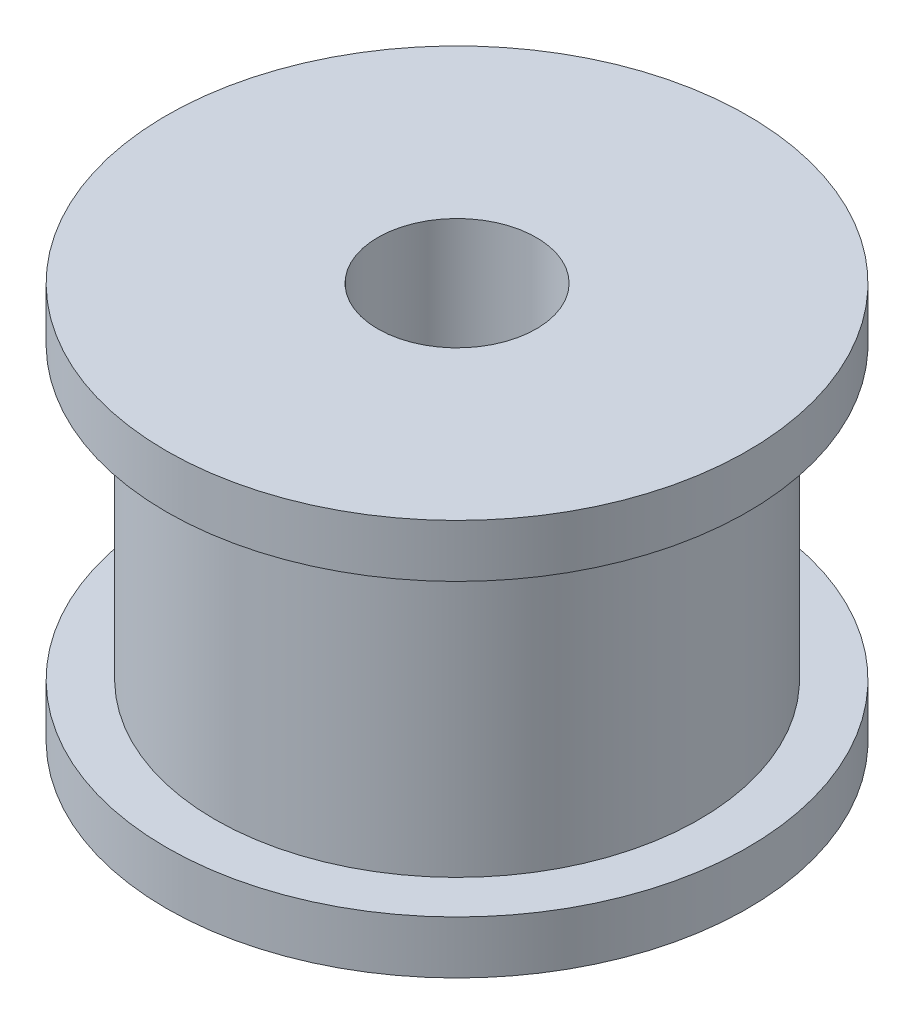
ISO-10303-21;
HEADER;
FILE_DESCRIPTION(('STEP AP214'),'2;1');
FILE_NAME('part.step','',(''),(''),'','','');
FILE_SCHEMA(('AUTOMOTIVE_DESIGN { 1 0 10303 214 1 1 1 1 }'));
ENDSEC;
DATA;
#1=APPLICATION_CONTEXT('core data for automotive mechanical design processes');
#2=APPLICATION_PROTOCOL_DEFINITION('international standard','automotive_design',2000,#1);
#3=PRODUCT_CONTEXT('',#1,'mechanical');
#4=PRODUCT('Part','Part','',(#3));
#5=PRODUCT_RELATED_PRODUCT_CATEGORY('part','',(#4));
#6=PRODUCT_DEFINITION_FORMATION('','',#4);
#7=PRODUCT_DEFINITION_CONTEXT('part definition',#1,'design');
#8=PRODUCT_DEFINITION('design','',#6,#7);
#9=PRODUCT_DEFINITION_SHAPE('','',#8);
#10=(LENGTH_UNIT() NAMED_UNIT(*) SI_UNIT(.MILLI.,.METRE.));
#11=(NAMED_UNIT(*) PLANE_ANGLE_UNIT() SI_UNIT($,.RADIAN.));
#12=(NAMED_UNIT(*) SI_UNIT($,.STERADIAN.) SOLID_ANGLE_UNIT());
#13=UNCERTAINTY_MEASURE_WITH_UNIT(LENGTH_MEASURE(1.E-05),#10,'distance_accuracy_value','');
#14=(GEOMETRIC_REPRESENTATION_CONTEXT(3) GLOBAL_UNCERTAINTY_ASSIGNED_CONTEXT((#13)) GLOBAL_UNIT_ASSIGNED_CONTEXT((#10,
#11,#12)) REPRESENTATION_CONTEXT('',''));
#15=CARTESIAN_POINT('',(0.,0.,0.));
#16=DIRECTION('',(0.,0.,1.));
#17=DIRECTION('',(1.,0.,0.));
#18=AXIS2_PLACEMENT_3D('',#15,#16,#17);
#19=CARTESIAN_POINT('',(0.,15.,0.));
#20=DIRECTION('',(0.,-1.,0.));
#21=DIRECTION('',(0.,0.,-1.));
#22=AXIS2_PLACEMENT_3D('',#19,#20,#21);
#23=CYLINDRICAL_SURFACE('',#22,11.);
#24=CARTESIAN_POINT('',(0.,0.,0.));
#25=DIRECTION('',(0.,1.,0.));
#26=DIRECTION('',(0.,0.,1.));
#27=AXIS2_PLACEMENT_3D('',#24,#25,#26);
#28=CIRCLE('',#27,11.);
#29=CARTESIAN_POINT('',(0.,0.,11.));
#30=VERTEX_POINT('',#29);
#31=EDGE_CURVE('E35',#30,#30,#28,.T.);
#32=ORIENTED_EDGE('',*,*,#31,.T.);
#33=EDGE_LOOP('',(#32));
#34=FACE_BOUND('',#33,.T.);
#35=CARTESIAN_POINT('',(0.,2.,0.));
#36=DIRECTION('',(0.,1.,0.));
#37=DIRECTION('',(0.,0.,1.));
#38=AXIS2_PLACEMENT_3D('',#35,#36,#37);
#39=CIRCLE('',#38,11.);
#40=CARTESIAN_POINT('',(0.,2.,11.));
#41=VERTEX_POINT('',#40);
#42=EDGE_CURVE('E50',#41,#41,#39,.T.);
#43=ORIENTED_EDGE('',*,*,#42,.F.);
#44=EDGE_LOOP('',(#43));
#45=FACE_BOUND('',#44,.T.);
#46=ADVANCED_FACE('F31',(#34,#45),#23,.T.);
#47=CARTESIAN_POINT('',(0.,15.,0.));
#48=DIRECTION('',(0.,1.,0.));
#49=DIRECTION('',(0.,0.,1.));
#50=AXIS2_PLACEMENT_3D('',#47,#48,#49);
#51=PLANE('',#50);
#52=CARTESIAN_POINT('',(0.,15.,0.));
#53=DIRECTION('',(0.,1.,0.));
#54=DIRECTION('',(0.,0.,1.));
#55=AXIS2_PLACEMENT_3D('',#52,#53,#54);
#56=CIRCLE('',#55,11.);
#57=CARTESIAN_POINT('',(0.,15.,11.));
#58=VERTEX_POINT('',#57);
#59=EDGE_CURVE('E10',#58,#58,#56,.T.);
#60=ORIENTED_EDGE('',*,*,#59,.T.);
#61=EDGE_LOOP('',(#60));
#62=FACE_BOUND('',#61,.T.);
#63=CARTESIAN_POINT('',(0.,15.,0.));
#64=DIRECTION('',(0.,1.,0.));
#65=DIRECTION('',(0.,0.,1.));
#66=AXIS2_PLACEMENT_3D('',#63,#64,#65);
#67=CIRCLE('',#66,3.);
#68=CARTESIAN_POINT('',(0.,15.,3.));
#69=VERTEX_POINT('',#68);
#70=EDGE_CURVE('E42',#69,#69,#67,.T.);
#71=ORIENTED_EDGE('',*,*,#70,.F.);
#72=EDGE_LOOP('',(#71));
#73=FACE_BOUND('',#72,.T.);
#74=ADVANCED_FACE('F82',(#62,#73),#51,.T.);
#75=CARTESIAN_POINT('',(0.,0.,0.));
#76=DIRECTION('',(0.,1.,0.));
#77=DIRECTION('',(0.,0.,1.));
#78=AXIS2_PLACEMENT_3D('',#75,#76,#77);
#79=PLANE('',#78);
#80=ORIENTED_EDGE('',*,*,#31,.F.);
#81=EDGE_LOOP('',(#80));
#82=FACE_BOUND('',#81,.T.);
#83=CARTESIAN_POINT('',(0.,0.,0.));
#84=DIRECTION('',(0.,1.,0.));
#85=DIRECTION('',(0.,0.,1.));
#86=AXIS2_PLACEMENT_3D('',#83,#84,#85);
#87=CIRCLE('',#86,3.);
#88=CARTESIAN_POINT('',(0.,0.,3.));
#89=VERTEX_POINT('',#88);
#90=EDGE_CURVE('E44',#89,#89,#87,.T.);
#91=ORIENTED_EDGE('',*,*,#90,.T.);
#92=EDGE_LOOP('',(#91));
#93=FACE_BOUND('',#92,.T.);
#94=ADVANCED_FACE('F87',(#82,#93),#79,.F.);
#95=CARTESIAN_POINT('',(0.,13.,0.));
#96=DIRECTION('',(0.,1.,0.));
#97=DIRECTION('',(0.,0.,1.));
#98=AXIS2_PLACEMENT_3D('',#95,#96,#97);
#99=CIRCLE('',#98,11.);
#100=CARTESIAN_POINT('',(0.,13.,11.));
#101=VERTEX_POINT('',#100);
#102=EDGE_CURVE('E47',#101,#101,#99,.T.);
#103=ORIENTED_EDGE('',*,*,#102,.T.);
#104=EDGE_LOOP('',(#103));
#105=FACE_BOUND('',#104,.T.);
#106=ORIENTED_EDGE('',*,*,#59,.F.);
#107=EDGE_LOOP('',(#106));
#108=FACE_BOUND('',#107,.T.);
#109=ADVANCED_FACE('F33',(#105,#108),#23,.T.);
#110=CARTESIAN_POINT('',(0.,15.,0.));
#111=DIRECTION('',(0.,-1.,0.));
#112=DIRECTION('',(0.,0.,-1.));
#113=AXIS2_PLACEMENT_3D('',#110,#111,#112);
#114=CYLINDRICAL_SURFACE('',#113,3.);
#115=ORIENTED_EDGE('',*,*,#70,.T.);
#116=EDGE_LOOP('',(#115));
#117=FACE_BOUND('',#116,.T.);
#118=ORIENTED_EDGE('',*,*,#90,.F.);
#119=EDGE_LOOP('',(#118));
#120=FACE_BOUND('',#119,.T.);
#121=ADVANCED_FACE('F77',(#117,#120),#114,.F.);
#122=CARTESIAN_POINT('',(0.,13.,0.));
#123=DIRECTION('',(0.,1.,0.));
#124=DIRECTION('',(0.,0.,1.));
#125=AXIS2_PLACEMENT_3D('',#122,#123,#124);
#126=PLANE('',#125);
#127=ORIENTED_EDGE('',*,*,#102,.F.);
#128=EDGE_LOOP('',(#127));
#129=FACE_BOUND('',#128,.T.);
#130=CARTESIAN_POINT('',(0.,13.,0.));
#131=DIRECTION('',(0.,1.,0.));
#132=DIRECTION('',(0.,0.,1.));
#133=AXIS2_PLACEMENT_3D('',#130,#131,#132);
#134=CIRCLE('',#133,9.165);
#135=CARTESIAN_POINT('',(0.,13.,9.165));
#136=VERTEX_POINT('',#135);
#137=EDGE_CURVE('E53',#136,#136,#134,.T.);
#138=ORIENTED_EDGE('',*,*,#137,.T.);
#139=EDGE_LOOP('',(#138));
#140=FACE_BOUND('',#139,.T.);
#141=ADVANCED_FACE('F62',(#129,#140),#126,.F.);
#142=CARTESIAN_POINT('',(0.,2.,0.));
#143=DIRECTION('',(0.,1.,0.));
#144=DIRECTION('',(0.,0.,1.));
#145=AXIS2_PLACEMENT_3D('',#142,#143,#144);
#146=PLANE('',#145);
#147=ORIENTED_EDGE('',*,*,#42,.T.);
#148=EDGE_LOOP('',(#147));
#149=FACE_BOUND('',#148,.T.);
#150=CARTESIAN_POINT('',(0.,2.,0.));
#151=DIRECTION('',(0.,1.,0.));
#152=DIRECTION('',(0.,0.,1.));
#153=AXIS2_PLACEMENT_3D('',#150,#151,#152);
#154=CIRCLE('',#153,9.165);
#155=CARTESIAN_POINT('',(0.,2.,9.165));
#156=VERTEX_POINT('',#155);
#157=EDGE_CURVE('E56',#156,#156,#154,.T.);
#158=ORIENTED_EDGE('',*,*,#157,.F.);
#159=EDGE_LOOP('',(#158));
#160=FACE_BOUND('',#159,.T.);
#161=ADVANCED_FACE('F67',(#149,#160),#146,.T.);
#162=CARTESIAN_POINT('',(0.,13.,0.));
#163=DIRECTION('',(0.,-1.,0.));
#164=DIRECTION('',(0.,0.,-1.));
#165=AXIS2_PLACEMENT_3D('',#162,#163,#164);
#166=CYLINDRICAL_SURFACE('',#165,9.165);
#167=ORIENTED_EDGE('',*,*,#137,.F.);
#168=EDGE_LOOP('',(#167));
#169=FACE_BOUND('',#168,.T.);
#170=ORIENTED_EDGE('',*,*,#157,.T.);
#171=EDGE_LOOP('',(#170));
#172=FACE_BOUND('',#171,.T.);
#173=ADVANCED_FACE('F64',(#169,#172),#166,.T.);
#174=CLOSED_SHELL('',(#46,#74,#94,#109,#121,#141,#161,#173));
#175=MANIFOLD_SOLID_BREP('B2',#174);
#176=ADVANCED_BREP_SHAPE_REPRESENTATION('',(#18,#175),#14);
#177=SHAPE_DEFINITION_REPRESENTATION(#9,#176);
ENDSEC;
END-ISO-10303-21;
